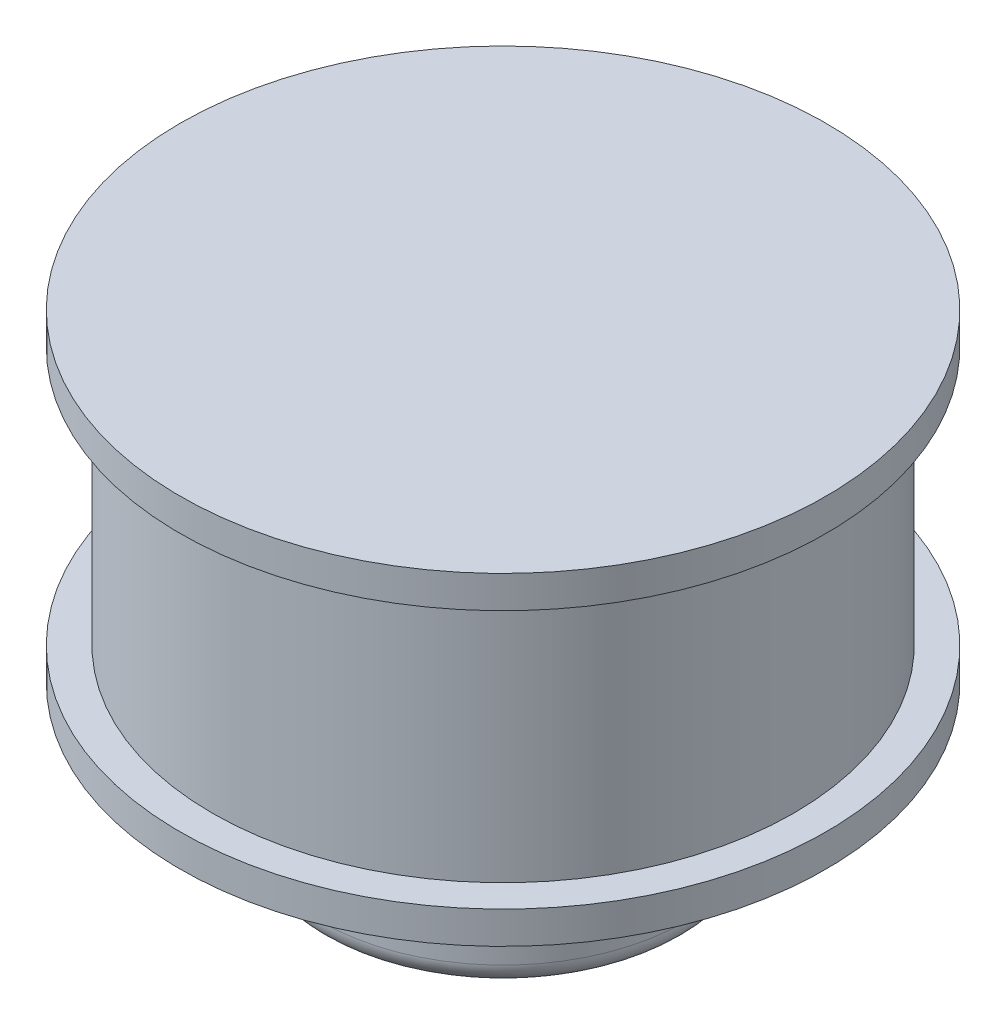
ISO-10303-21;
HEADER;
FILE_DESCRIPTION(('STEP AP214'),'2;1');
FILE_NAME('part.step','',(''),(''),'','','');
FILE_SCHEMA(('AUTOMOTIVE_DESIGN { 1 0 10303 214 1 1 1 1 }'));
ENDSEC;
DATA;
#1=APPLICATION_CONTEXT('core data for automotive mechanical design processes');
#2=APPLICATION_PROTOCOL_DEFINITION('international standard','automotive_design',2000,#1);
#3=PRODUCT_CONTEXT('',#1,'mechanical');
#4=PRODUCT('Part','Part','',(#3));
#5=PRODUCT_RELATED_PRODUCT_CATEGORY('part','',(#4));
#6=PRODUCT_DEFINITION_FORMATION('','',#4);
#7=PRODUCT_DEFINITION_CONTEXT('part definition',#1,'design');
#8=PRODUCT_DEFINITION('design','',#6,#7);
#9=PRODUCT_DEFINITION_SHAPE('','',#8);
#10=(LENGTH_UNIT() NAMED_UNIT(*) SI_UNIT(.MILLI.,.METRE.));
#11=(NAMED_UNIT(*) PLANE_ANGLE_UNIT() SI_UNIT($,.RADIAN.));
#12=(NAMED_UNIT(*) SI_UNIT($,.STERADIAN.) SOLID_ANGLE_UNIT());
#13=UNCERTAINTY_MEASURE_WITH_UNIT(LENGTH_MEASURE(1.E-05),#10,'distance_accuracy_value','');
#14=(GEOMETRIC_REPRESENTATION_CONTEXT(3) GLOBAL_UNCERTAINTY_ASSIGNED_CONTEXT((#13)) GLOBAL_UNIT_ASSIGNED_CONTEXT((#10,
#11,#12)) REPRESENTATION_CONTEXT('',''));
#15=CARTESIAN_POINT('',(0.,0.,0.));
#16=DIRECTION('',(0.,0.,1.));
#17=DIRECTION('',(1.,0.,0.));
#18=AXIS2_PLACEMENT_3D('',#15,#16,#17);
#19=CARTESIAN_POINT('',(0.,7.65,0.));
#20=DIRECTION('',(0.,-1.,0.));
#21=DIRECTION('',(1.,0.,0.));
#22=AXIS2_PLACEMENT_3D('',#19,#20,#21);
#23=PLANE('',#22);
#24=CARTESIAN_POINT('',(0.,7.65,0.));
#25=DIRECTION('',(0.,1.,0.));
#26=DIRECTION('',(-1.,0.,0.));
#27=AXIS2_PLACEMENT_3D('',#24,#25,#26);
#28=CIRCLE('',#27,4.);
#29=CARTESIAN_POINT('',(-4.00000000000001,7.65,0.));
#30=VERTEX_POINT('',#29);
#31=EDGE_CURVE('E57',#30,#30,#28,.T.);
#32=ORIENTED_EDGE('',*,*,#31,.F.);
#33=EDGE_LOOP('',(#32));
#34=FACE_BOUND('',#33,.T.);
#35=ADVANCED_FACE('F37',(#34),#23,.T.);
#36=CARTESIAN_POINT('',(0.,15.,0.));
#37=DIRECTION('',(0.,1.,0.));
#38=DIRECTION('',(-1.,0.,0.));
#39=AXIS2_PLACEMENT_3D('',#36,#37,#38);
#40=CYLINDRICAL_SURFACE('',#39,3.99999999999999);
#41=CARTESIAN_POINT('',(-1.25,-2.35,3.79967103839267));
#42=CARTESIAN_POINT('',(-1.24999953780047,-2.28165296389066,3.79967145961936));
#43=CARTESIAN_POINT('',(-1.24437538791494,-2.2133012312968,3.80153531505043));
#44=CARTESIAN_POINT('',(-1.22209175401327,-2.07860583912219,3.80875638998877));
#45=CARTESIAN_POINT('',(-1.20542928782515,-2.01226272726784,3.81411455353136));
#46=CARTESIAN_POINT('',(-1.16169788223559,-1.883555098068,3.8276593883596));
#47=CARTESIAN_POINT('',(-1.13464735736677,-1.82118376689432,3.83584105194317));
#48=CARTESIAN_POINT('',(-1.07096914173157,-1.70184730413599,3.85410406218688));
#49=CARTESIAN_POINT('',(-1.03433975905632,-1.64488313003988,3.8641857443584));
#50=CARTESIAN_POINT('',(-0.951196070622291,-1.53602113250651,3.8855012766862));
#51=CARTESIAN_POINT('',(-0.904409399720397,-1.48433639056401,3.8967612338478));
#52=CARTESIAN_POINT('',(-0.802862046455493,-1.38940398679081,3.91894245860335));
#53=CARTESIAN_POINT('',(-0.748100252518563,-1.34615750305515,3.92986367872627));
#54=CARTESIAN_POINT('',(-0.630625912493361,-1.26838893698876,3.95043553390078));
#55=CARTESIAN_POINT('',(-0.567761556520093,-1.23408629616854,3.9600518456278));
#56=CARTESIAN_POINT('',(-0.436804232853402,-1.17662395014445,3.97662551833018));
#57=CARTESIAN_POINT('',(-0.368712498487051,-1.15346162585042,3.98358350419919));
#58=CARTESIAN_POINT('',(-0.231464356966097,-1.11964887190293,3.99387175820862));
#59=CARTESIAN_POINT('',(-0.162405715468215,-1.10863425021215,3.99730738984143));
#60=CARTESIAN_POINT('',(-0.0233408139845202,-1.09827565356248,4.00053595876014));
#61=CARTESIAN_POINT('',(0.0466652269730834,-1.09892902564117,4.00032972410064));
#62=CARTESIAN_POINT('',(0.183074480354734,-1.11164829158595,3.99637116132536));
#63=CARTESIAN_POINT('',(0.249518634314043,-1.12331938351302,3.99274150972157));
#64=CARTESIAN_POINT('',(0.379453063347769,-1.157094990043,3.98249482560854));
#65=CARTESIAN_POINT('',(0.442943145481195,-1.17920018508655,3.97587759827133));
#66=CARTESIAN_POINT('',(0.56607810315478,-1.23347018907489,3.96023459729532));
#67=CARTESIAN_POINT('',(0.62566640562283,-1.26575480856303,3.95118033616956));
#68=CARTESIAN_POINT('',(0.738702511152028,-1.33937109970456,3.93161722953561));
#69=CARTESIAN_POINT('',(0.792148756208836,-1.38070505913784,3.92110801644584));
#70=CARTESIAN_POINT('',(0.893737698453879,-1.47327363480129,3.89923670734646));
#71=CARTESIAN_POINT('',(0.941566549094177,-1.5248490688412,3.88785731989083));
#72=CARTESIAN_POINT('',(1.02798974259538,-1.63539510182446,3.86590615440412));
#73=CARTESIAN_POINT('',(1.06658299775341,-1.694366570575,3.85533447159846));
#74=CARTESIAN_POINT('',(1.13380465019765,-1.81891746885984,3.83610846648973));
#75=CARTESIAN_POINT('',(1.16231680702682,-1.88456340904239,3.82747690354323));
#76=CARTESIAN_POINT('',(1.20778345948513,-2.02005949189535,3.81337545338912));
#77=CARTESIAN_POINT('',(1.22474210765793,-2.08990811421048,3.80790443033293));
#78=CARTESIAN_POINT('',(1.24601485185708,-2.22881995256584,3.80099563391871));
#79=CARTESIAN_POINT('',(1.25080954353711,-2.29780199623211,3.79940466389695));
#80=CARTESIAN_POINT('',(1.24896744498307,-2.43558974149816,3.80001077463983));
#81=CARTESIAN_POINT('',(1.24233242111456,-2.50439546870047,3.80220727008389));
#82=CARTESIAN_POINT('',(1.21824873513143,-2.63780829665165,3.80998957482873));
#83=CARTESIAN_POINT('',(1.20111831160537,-2.70247927407399,3.81547554101731));
#84=CARTESIAN_POINT('',(1.15690373661027,-2.82802179199604,3.8291128733166));
#85=CARTESIAN_POINT('',(1.12981796171154,-2.88889271092119,3.83726467412387));
#86=CARTESIAN_POINT('',(1.06557510655875,-3.00703910977175,3.85560539653155));
#87=CARTESIAN_POINT('',(1.02815147488557,-3.06416141559277,3.86584603489732));
#88=CARTESIAN_POINT('',(0.94460640867981,-3.17149034636192,3.88710348972828));
#89=CARTESIAN_POINT('',(0.898482714690783,-3.22169516892534,3.89812050735702));
#90=CARTESIAN_POINT('',(0.796572947753604,-3.31591036591281,3.92024187562679));
#91=CARTESIAN_POINT('',(0.740465649788521,-3.35957778613986,3.93133092285679));
#92=CARTESIAN_POINT('',(0.621451545651398,-3.43689104332125,3.95189059843678));
#93=CARTESIAN_POINT('',(0.558545051108623,-3.47053733931104,3.96136130090945));
#94=CARTESIAN_POINT('',(0.428105523331832,-3.52653056247168,3.97756311928511));
#95=CARTESIAN_POINT('',(0.360610184283756,-3.54895928784368,3.98431399561199));
#96=CARTESIAN_POINT('',(0.22255725405639,-3.5820725385897,3.99440242648576));
#97=CARTESIAN_POINT('',(0.152000628340357,-3.59276073908349,3.99774104914277));
#98=CARTESIAN_POINT('',(0.0129849366488996,-3.60179100174962,4.00055803404461));
#99=CARTESIAN_POINT('',(-0.0554391919465212,-3.60062845017076,4.00019129407389));
#100=CARTESIAN_POINT('',(-0.191073221923247,-3.5871881889513,3.99600978081048));
#101=CARTESIAN_POINT('',(-0.258283202179567,-3.57491120400805,3.99219523232618));
#102=CARTESIAN_POINT('',(-0.38875511848079,-3.53990599077772,3.98159570844795));
#103=CARTESIAN_POINT('',(-0.45205591844948,-3.51731039215463,3.97484847960205));
#104=CARTESIAN_POINT('',(-0.57399842550009,-3.46242917279152,3.9590794558795));
#105=CARTESIAN_POINT('',(-0.632639331274481,-3.43014189002657,3.95005727091358));
#106=CARTESIAN_POINT('',(-0.745761694969687,-3.35552724165556,3.93029896883376));
#107=CARTESIAN_POINT('',(-0.80003460705311,-3.31289647753603,3.91951509750962));
#108=CARTESIAN_POINT('',(-0.900820791399317,-3.21934011055653,3.89758736547061));
#109=CARTESIAN_POINT('',(-0.947331733504159,-3.16841202586061,3.88644339784826));
#110=CARTESIAN_POINT('',(-1.03282865911252,-3.0576842801589,3.86461892577438));
#111=CARTESIAN_POINT('',(-1.07151427994711,-2.99764659688342,3.85396600863456));
#112=CARTESIAN_POINT('',(-1.13820470748521,-2.87160187973086,3.83480125279531));
#113=CARTESIAN_POINT('',(-1.16621383403546,-2.80559727354975,3.82628854861386));
#114=CARTESIAN_POINT('',(-1.20871180435792,-2.67527738268533,3.81306560440327));
#115=CARTESIAN_POINT('',(-1.22414939837873,-2.61129745254843,3.80809315043749));
#116=CARTESIAN_POINT('',(-1.24479245816099,-2.48154616790351,3.80139606482399));
#117=CARTESIAN_POINT('',(-1.25000044480778,-2.4157752587985,3.79967063301598));
#118=CARTESIAN_POINT('',(-1.25,-2.35,3.79967103839267));
#119=B_SPLINE_CURVE_WITH_KNOTS('',3,(#41,#42,#43,#44,#45,#46,#47,#48,#49,#50,#51,#52,#53,#54,
#55,#56,#57,#58,#59,#60,#61,#62,#63,#64,#65,#66,#67,#68,#69,#70,#71,#72,#73,#74,#75,#76,#77,#78,
#79,#80,#81,#82,#83,#84,#85,#86,#87,#88,#89,#90,#91,#92,#93,#94,#95,#96,#97,#98,#99,#100,#101,
#102,#103,#104,#105,#106,#107,#108,#109,#110,#111,#112,#113,#114,#115,#116,#117,#118),
.UNSPECIFIED.,.T.,.F.,(4,2,2,2,2,2,2,2,2,2,2,2,2,2,2,2,2,2,2,2,2,2,2,2,2,2,2,2,2,2,2,2,2,2,2,2,
2,2,4),(0.,0.20479813754849,0.409651627059735,0.614143644118582,0.818671804924948,
1.02957080550838,1.24049922941123,1.45619821963733,1.67184647417922,1.88083722835533,
2.08978046471774,2.2915098296975,2.49325235190093,2.69746404608409,2.90172742713187,
3.11450338937334,3.32730439853776,3.54248470934454,3.75758763952752,3.96404933287935,
4.17047912219089,4.37093972044363,4.57143302253209,4.7776761330961,4.9839728801188,
5.19881937811511,5.41365603317086,5.62690239290998,5.84008198140584,6.04438802439524,
6.24868074692306,6.45041846514759,6.65219079911652,6.86080693105215,7.0694855777219,
7.28507795501704,7.50058300803822,7.69772354371386,7.89481549188779),.UNSPECIFIED.);
#120=CARTESIAN_POINT('',(-1.25,-2.35,3.79967103839267));
#121=VERTEX_POINT('',#120);
#122=EDGE_CURVE('E81',#121,#121,#119,.T.);
#123=ORIENTED_EDGE('',*,*,#122,.F.);
#124=EDGE_LOOP('',(#123));
#125=FACE_BOUND('',#124,.T.);
#126=CARTESIAN_POINT('',(0.,-5.35000000000001,0.));
#127=DIRECTION('',(0.,-1.,0.));
#128=DIRECTION('',(1.,0.,0.));
#129=AXIS2_PLACEMENT_3D('',#126,#127,#128);
#130=CIRCLE('',#129,3.99999999999999);
#131=CARTESIAN_POINT('',(3.99999999999998,-5.35000000000001,0.));
#132=VERTEX_POINT('',#131);
#133=EDGE_CURVE('E10',#132,#132,#130,.T.);
#134=ORIENTED_EDGE('',*,*,#133,.T.);
#135=EDGE_LOOP('',(#134));
#136=FACE_BOUND('',#135,.T.);
#137=ORIENTED_EDGE('',*,*,#31,.T.);
#138=EDGE_LOOP('',(#137));
#139=FACE_BOUND('',#138,.T.);
#140=ADVANCED_FACE('F94',(#125,#136,#139),#40,.F.);
#141=CARTESIAN_POINT('',(-4.00000000000001,-6.35,0.));
#142=DIRECTION('',(0.,-1.,0.));
#143=DIRECTION('',(1.,0.,0.));
#144=AXIS2_PLACEMENT_3D('',#141,#142,#143);
#145=PLANE('',#144);
#146=CARTESIAN_POINT('',(0.,-6.35,0.));
#147=DIRECTION('',(0.,-1.,0.));
#148=DIRECTION('',(1.,0.,0.));
#149=AXIS2_PLACEMENT_3D('',#146,#147,#148);
#150=CIRCLE('',#149,7.49999999999998);
#151=CARTESIAN_POINT('',(7.49999999999997,-6.35000000000001,0.));
#152=VERTEX_POINT('',#151);
#153=EDGE_CURVE('E44',#152,#152,#150,.T.);
#154=ORIENTED_EDGE('',*,*,#153,.T.);
#155=EDGE_LOOP('',(#154));
#156=FACE_BOUND('',#155,.T.);
#157=CARTESIAN_POINT('',(0.,-6.35,0.));
#158=DIRECTION('',(0.,-1.,0.));
#159=DIRECTION('',(1.,0.,0.));
#160=AXIS2_PLACEMENT_3D('',#157,#158,#159);
#161=CIRCLE('',#160,4.99999999999999);
#162=CARTESIAN_POINT('',(4.99999999999998,-6.35000000000001,0.));
#163=VERTEX_POINT('',#162);
#164=EDGE_CURVE('E48',#163,#163,#161,.F.);
#165=ORIENTED_EDGE('',*,*,#164,.T.);
#166=EDGE_LOOP('',(#165));
#167=FACE_BOUND('',#166,.T.);
#168=ADVANCED_FACE('F136',(#156,#167),#145,.T.);
#169=CARTESIAN_POINT('',(0.,15.,0.));
#170=DIRECTION('',(0.,1.,0.));
#171=DIRECTION('',(-1.,0.,0.));
#172=AXIS2_PLACEMENT_3D('',#169,#170,#171);
#173=CYLINDRICAL_SURFACE('',#172,8.49999999999998);
#174=CARTESIAN_POINT('',(-1.25,-2.35,8.4075858604001));
#175=CARTESIAN_POINT('',(-1.24999710510227,-2.41980453073489,8.40758700940733));
#176=CARTESIAN_POINT('',(-1.24413302561147,-2.48964997741464,8.40846460016199));
#177=CARTESIAN_POINT('',(-1.22083722377046,-2.62738920999669,8.41187789658695));
#178=CARTESIAN_POINT('',(-1.20339411636136,-2.69528100635837,8.41441523416454));
#179=CARTESIAN_POINT('',(-1.15747242113108,-2.82709919596176,8.42085456460098));
#180=CARTESIAN_POINT('',(-1.12900217790827,-2.89102854538422,8.42475552534397));
#181=CARTESIAN_POINT('',(-1.06185381528302,-3.01319320199757,8.4334813344008));
#182=CARTESIAN_POINT('',(-1.02317714404783,-3.07142931538375,8.43830605161826));
#183=CARTESIAN_POINT('',(-0.936395680627589,-3.18101217151486,8.44837729235548));
#184=CARTESIAN_POINT('',(-0.888227811627049,-3.23230872243697,8.45362649120865));
#185=CARTESIAN_POINT('',(-0.783967427241611,-3.32612155151427,8.46393134335554));
#186=CARTESIAN_POINT('',(-0.727874481842023,-3.36863735291758,8.46898698612797));
#187=CARTESIAN_POINT('',(-0.609035362725141,-3.443866414533,8.47836301592179));
#188=CARTESIAN_POINT('',(-0.546259688480515,-3.47653354619391,8.48267990326486));
#189=CARTESIAN_POINT('',(-0.416038601354241,-3.53084201956213,8.49006242091286));
#190=CARTESIAN_POINT('',(-0.348593426034826,-3.55248392171367,8.49312811481798));
#191=CARTESIAN_POINT('',(-0.211464398495229,-3.58397570100462,8.4976439545144));
#192=CARTESIAN_POINT('',(-0.141800218809726,-3.59390956510211,8.49910560156348));
#193=CARTESIAN_POINT('',(-0.00177945680602902,-3.60196400477364,8.50028806047438));
#194=CARTESIAN_POINT('',(0.0685770882440763,-3.60008521275468,8.50000896552925));
#195=CARTESIAN_POINT('',(0.207412609267973,-3.58463408157611,8.4977505909803));
#196=CARTESIAN_POINT('',(0.275901884682541,-3.57115209517445,8.49578444857935));
#197=CARTESIAN_POINT('',(0.409635277137456,-3.53301903013746,8.49038753926087));
#198=CARTESIAN_POINT('',(0.474879313262818,-3.50836767316603,8.48695673584471));
#199=CARTESIAN_POINT('',(0.600544454522746,-3.44850267880972,8.47899339387313));
#200=CARTESIAN_POINT('',(0.660947113655844,-3.41325087024622,8.47445688515937));
#201=CARTESIAN_POINT('',(0.775013746624385,-3.33321349734632,8.4647879743403));
#202=CARTESIAN_POINT('',(0.828677293524277,-3.2884273294741,8.45965553452123));
#203=CARTESIAN_POINT('',(0.928274771197665,-3.19008886925554,8.44931012765941));
#204=CARTESIAN_POINT('',(0.974130833440613,-3.13645770813847,8.44409685803328));
#205=CARTESIAN_POINT('',(1.05620396332034,-3.02221998520642,8.4342247592641));
#206=CARTESIAN_POINT('',(1.09242097588368,-2.96161338353955,8.42956593328899));
#207=CARTESIAN_POINT('',(1.15419768439827,-2.83506551078188,8.42133032189467));
#208=CARTESIAN_POINT('',(1.17974960098851,-2.76912038736885,8.41775432683683));
#209=CARTESIAN_POINT('',(1.21939363445995,-2.63381043135111,8.41210341899181));
#210=CARTESIAN_POINT('',(1.23348652609985,-2.56444583027786,8.41002840472254));
#211=CARTESIAN_POINT('',(1.24970613657199,-2.424958088404,8.40763356673706));
#212=CARTESIAN_POINT('',(1.25194313773078,-2.35484803916849,8.407297567564));
#213=CARTESIAN_POINT('',(1.2446798881272,-2.2152540518017,8.40837587949709));
#214=CARTESIAN_POINT('',(1.23517998693919,-2.14577009508484,8.40979013847319));
#215=CARTESIAN_POINT('',(1.20480604960235,-2.00974092572747,8.4141947693031));
#216=CARTESIAN_POINT('',(1.18398676081403,-1.94318322137568,8.41717755257086));
#217=CARTESIAN_POINT('',(1.13162190536935,-1.81450233792372,8.42437690391729));
#218=CARTESIAN_POINT('',(1.10007582796816,-1.75237937014933,8.42859353074281));
#219=CARTESIAN_POINT('',(1.02688712390612,-1.63383645623596,8.43782365247835));
#220=CARTESIAN_POINT('',(0.985172989894861,-1.57746109871345,8.4428427004129));
#221=CARTESIAN_POINT('',(0.892931901207412,-1.47247162445458,8.45309533274158));
#222=CARTESIAN_POINT('',(0.842404468153761,-1.42385792928834,8.45832892876937));
#223=CARTESIAN_POINT('',(0.733485882129774,-1.33537678145347,8.4684714097738));
#224=CARTESIAN_POINT('',(0.675035107129496,-1.29558233714803,8.4733773652361));
#225=CARTESIAN_POINT('',(0.552214316327239,-1.22637752257722,8.48226649910812));
#226=CARTESIAN_POINT('',(0.487844457355883,-1.19696687728508,8.48624970195703));
#227=CARTESIAN_POINT('',(0.35524251224269,-1.14948167280522,8.49283167617489));
#228=CARTESIAN_POINT('',(0.287025077389439,-1.1313669085891,8.49543535260938));
#229=CARTESIAN_POINT('',(0.148475541166708,-1.10685746976604,8.49898547341226));
#230=CARTESIAN_POINT('',(0.078143574092852,-1.10046205244554,8.4999320228009));
#231=CARTESIAN_POINT('',(-0.0619298668379427,-1.09959043847321,8.50006025774636));
#232=CARTESIAN_POINT('',(-0.131670655626724,-1.10500242581344,8.49925849979375));
#233=CARTESIAN_POINT('',(-0.269239179820509,-1.12735268404478,8.49601352815674));
#234=CARTESIAN_POINT('',(-0.337066920661138,-1.14429092218239,8.49357031913675));
#235=CARTESIAN_POINT('',(-0.468855272056407,-1.18917375779886,8.48731568295443));
#236=CARTESIAN_POINT('',(-0.53281846476078,-1.21711091026107,8.48350518144818));
#237=CARTESIAN_POINT('',(-0.65516692911588,-1.28318667714564,8.47493492093454));
#238=CARTESIAN_POINT('',(-0.713552033805032,-1.32132559679434,8.47017513352659));
#239=CARTESIAN_POINT('',(-0.823654696466402,-1.40712783748201,8.46018209258475));
#240=CARTESIAN_POINT('',(-0.875307495715044,-1.45487381362391,8.45494496231287));
#241=CARTESIAN_POINT('',(-0.969908817337546,-1.55836101063896,8.44461647463573));
#242=CARTESIAN_POINT('',(-1.01285529235082,-1.61410410684719,8.43952515175938));
#243=CARTESIAN_POINT('',(-1.08903160606815,-1.73235548954973,8.43003535108944));
#244=CARTESIAN_POINT('',(-1.12220785319988,-1.79489860353564,8.42564075353029));
#245=CARTESIAN_POINT('',(-1.17753570240274,-1.92470372470936,8.41808744433525));
#246=CARTESIAN_POINT('',(-1.19969881567852,-1.99196072054425,8.41492744301017));
#247=CARTESIAN_POINT('',(-1.22730605825343,-2.10793825107537,8.41093594969733));
#248=CARTESIAN_POINT('',(-1.23580336635801,-2.15594037642951,8.40968627498972));
#249=CARTESIAN_POINT('',(-1.24715131261068,-2.25262170189715,8.40801083456297));
#250=CARTESIAN_POINT('',(-1.25000201962438,-2.3013008937459,8.40758505879561));
#251=CARTESIAN_POINT('',(-1.25,-2.35,8.4075858604001));
#252=B_SPLINE_CURVE_WITH_KNOTS('',3,(#174,#175,#176,#177,#178,#179,#180,#181,#182,#183,#184,
#185,#186,#187,#188,#189,#190,#191,#192,#193,#194,#195,#196,#197,#198,#199,#200,#201,#202,#203,
#204,#205,#206,#207,#208,#209,#210,#211,#212,#213,#214,#215,#216,#217,#218,#219,#220,#221,#222,
#223,#224,#225,#226,#227,#228,#229,#230,#231,#232,#233,#234,#235,#236,#237,#238,#239,#240,#241,
#242,#243,#244,#245,#246,#247,#248,#249,#250,#251),.UNSPECIFIED.,.T.,.F.,(4,2,2,2,2,2,2,2,2,2,2,
2,2,2,2,2,2,2,2,2,2,2,2,2,2,2,2,2,2,2,2,2,2,2,2,2,2,2,4),(0.,0.209235604041356,
0.418677243956453,0.627960701137761,0.837214479508835,1.04790891372791,1.25861478462188,
1.47029273888423,1.68195993187107,1.8920993174321,2.10222745298405,2.3107339980099,
2.51924573921819,2.72851748935693,2.93780249057731,3.14906598586866,3.36033068820407,
3.57174922359479,3.78315346353082,3.99258774581622,4.20201579041742,4.41043981091346,
4.61887375669135,4.82881810275996,5.03877384795543,5.2504076330159,5.46203581229343,
5.67290638591943,5.8837635951614,6.09263266274006,6.30150113679018,6.51022847299387,
6.71896205480251,6.92957482323234,7.14023706160589,7.35203417379323,7.56360944219752,
7.70958436789297,7.85555751327589),.UNSPECIFIED.);
#253=CARTESIAN_POINT('',(-1.25,-2.35,8.4075858604001));
#254=VERTEX_POINT('',#253);
#255=EDGE_CURVE('E89',#254,#254,#252,.T.);
#256=ORIENTED_EDGE('',*,*,#255,.F.);
#257=EDGE_LOOP('',(#256));
#258=FACE_BOUND('',#257,.T.);
#259=CARTESIAN_POINT('',(0.,-5.35000000000001,0.));
#260=DIRECTION('',(0.,-1.,0.));
#261=DIRECTION('',(1.,0.,0.));
#262=AXIS2_PLACEMENT_3D('',#259,#260,#261);
#263=CIRCLE('',#262,8.49999999999998);
#264=CARTESIAN_POINT('',(8.49999999999997,-5.35000000000001,0.));
#265=VERTEX_POINT('',#264);
#266=EDGE_CURVE('E52',#265,#265,#263,.F.);
#267=ORIENTED_EDGE('',*,*,#266,.T.);
#268=EDGE_LOOP('',(#267));
#269=FACE_BOUND('',#268,.T.);
#270=CARTESIAN_POINT('',(0.,0.,0.));
#271=DIRECTION('',(0.,1.,0.));
#272=DIRECTION('',(-1.,0.,0.));
#273=AXIS2_PLACEMENT_3D('',#270,#271,#272);
#274=CIRCLE('',#273,8.49999999999998);
#275=CARTESIAN_POINT('',(-8.49999999999999,0.,0.));
#276=VERTEX_POINT('',#275);
#277=EDGE_CURVE('E60',#276,#276,#274,.T.);
#278=ORIENTED_EDGE('',*,*,#277,.F.);
#279=EDGE_LOOP('',(#278));
#280=FACE_BOUND('',#279,.T.);
#281=ADVANCED_FACE('F133',(#258,#269,#280),#173,.T.);
#282=CARTESIAN_POINT('',(-8.49999999999999,0.,0.));
#283=DIRECTION('',(0.,-1.,0.));
#284=DIRECTION('',(1.,0.,0.));
#285=AXIS2_PLACEMENT_3D('',#282,#283,#284);
#286=PLANE('',#285);
#287=ORIENTED_EDGE('',*,*,#277,.T.);
#288=EDGE_LOOP('',(#287));
#289=FACE_BOUND('',#288,.T.);
#290=CARTESIAN_POINT('',(0.,0.,0.));
#291=DIRECTION('',(0.,1.,0.));
#292=DIRECTION('',(-1.,0.,0.));
#293=AXIS2_PLACEMENT_3D('',#290,#291,#292);
#294=CIRCLE('',#293,15.);
#295=CARTESIAN_POINT('',(-15.,0.,0.));
#296=VERTEX_POINT('',#295);
#297=EDGE_CURVE('E63',#296,#296,#294,.T.);
#298=ORIENTED_EDGE('',*,*,#297,.F.);
#299=EDGE_LOOP('',(#298));
#300=FACE_BOUND('',#299,.T.);
#301=ADVANCED_FACE('F129',(#289,#300),#286,.T.);
#302=CARTESIAN_POINT('',(0.,15.,0.));
#303=DIRECTION('',(0.,1.,0.));
#304=DIRECTION('',(-1.,0.,0.));
#305=AXIS2_PLACEMENT_3D('',#302,#303,#304);
#306=CYLINDRICAL_SURFACE('',#305,15.);
#307=ORIENTED_EDGE('',*,*,#297,.T.);
#308=EDGE_LOOP('',(#307));
#309=FACE_BOUND('',#308,.T.);
#310=CARTESIAN_POINT('',(0.,1.49999999999999,0.));
#311=DIRECTION('',(0.,1.,0.));
#312=DIRECTION('',(-1.,0.,0.));
#313=AXIS2_PLACEMENT_3D('',#310,#311,#312);
#314=CIRCLE('',#313,15.);
#315=CARTESIAN_POINT('',(-15.,1.5,0.));
#316=VERTEX_POINT('',#315);
#317=EDGE_CURVE('E66',#316,#316,#314,.T.);
#318=ORIENTED_EDGE('',*,*,#317,.F.);
#319=EDGE_LOOP('',(#318));
#320=FACE_BOUND('',#319,.T.);
#321=ADVANCED_FACE('F125',(#309,#320),#306,.T.);
#322=CARTESIAN_POINT('',(-15.,1.5,0.));
#323=DIRECTION('',(0.,1.,0.));
#324=DIRECTION('',(-1.,0.,0.));
#325=AXIS2_PLACEMENT_3D('',#322,#323,#324);
#326=PLANE('',#325);
#327=ORIENTED_EDGE('',*,*,#317,.T.);
#328=EDGE_LOOP('',(#327));
#329=FACE_BOUND('',#328,.T.);
#330=CARTESIAN_POINT('',(0.,1.49999999999999,0.));
#331=DIRECTION('',(0.,1.,0.));
#332=DIRECTION('',(-1.,0.,0.));
#333=AXIS2_PLACEMENT_3D('',#330,#331,#332);
#334=CIRCLE('',#333,13.5);
#335=CARTESIAN_POINT('',(-13.5,1.5,0.));
#336=VERTEX_POINT('',#335);
#337=EDGE_CURVE('E69',#336,#336,#334,.T.);
#338=ORIENTED_EDGE('',*,*,#337,.F.);
#339=EDGE_LOOP('',(#338));
#340=FACE_BOUND('',#339,.T.);
#341=ADVANCED_FACE('F121',(#329,#340),#326,.T.);
#342=CARTESIAN_POINT('',(0.,15.,0.));
#343=DIRECTION('',(0.,1.,0.));
#344=DIRECTION('',(-1.,0.,0.));
#345=AXIS2_PLACEMENT_3D('',#342,#343,#344);
#346=CYLINDRICAL_SURFACE('',#345,13.5);
#347=ORIENTED_EDGE('',*,*,#337,.T.);
#348=EDGE_LOOP('',(#347));
#349=FACE_BOUND('',#348,.T.);
#350=CARTESIAN_POINT('',(0.,13.5,0.));
#351=DIRECTION('',(0.,1.,0.));
#352=DIRECTION('',(-1.,0.,0.));
#353=AXIS2_PLACEMENT_3D('',#350,#351,#352);
#354=CIRCLE('',#353,13.5);
#355=CARTESIAN_POINT('',(-13.5,13.5,0.));
#356=VERTEX_POINT('',#355);
#357=EDGE_CURVE('E72',#356,#356,#354,.T.);
#358=ORIENTED_EDGE('',*,*,#357,.F.);
#359=EDGE_LOOP('',(#358));
#360=FACE_BOUND('',#359,.T.);
#361=ADVANCED_FACE('F117',(#349,#360),#346,.T.);
#362=CARTESIAN_POINT('',(-13.5,13.5,0.));
#363=DIRECTION('',(0.,-1.,0.));
#364=DIRECTION('',(1.,0.,0.));
#365=AXIS2_PLACEMENT_3D('',#362,#363,#364);
#366=PLANE('',#365);
#367=ORIENTED_EDGE('',*,*,#357,.T.);
#368=EDGE_LOOP('',(#367));
#369=FACE_BOUND('',#368,.T.);
#370=CARTESIAN_POINT('',(0.,13.5,0.));
#371=DIRECTION('',(0.,1.,0.));
#372=DIRECTION('',(-1.,0.,0.));
#373=AXIS2_PLACEMENT_3D('',#370,#371,#372);
#374=CIRCLE('',#373,15.);
#375=CARTESIAN_POINT('',(-15.,13.5,0.));
#376=VERTEX_POINT('',#375);
#377=EDGE_CURVE('E75',#376,#376,#374,.T.);
#378=ORIENTED_EDGE('',*,*,#377,.F.);
#379=EDGE_LOOP('',(#378));
#380=FACE_BOUND('',#379,.T.);
#381=ADVANCED_FACE('F113',(#369,#380),#366,.T.);
#382=CARTESIAN_POINT('',(0.,15.,0.));
#383=DIRECTION('',(0.,1.,0.));
#384=DIRECTION('',(-1.,0.,0.));
#385=AXIS2_PLACEMENT_3D('',#382,#383,#384);
#386=CYLINDRICAL_SURFACE('',#385,15.);
#387=ORIENTED_EDGE('',*,*,#377,.T.);
#388=EDGE_LOOP('',(#387));
#389=FACE_BOUND('',#388,.T.);
#390=CARTESIAN_POINT('',(0.,15.,0.));
#391=DIRECTION('',(0.,1.,0.));
#392=DIRECTION('',(-1.,0.,0.));
#393=AXIS2_PLACEMENT_3D('',#390,#391,#392);
#394=CIRCLE('',#393,15.);
#395=CARTESIAN_POINT('',(-15.,15.,0.));
#396=VERTEX_POINT('',#395);
#397=EDGE_CURVE('E78',#396,#396,#394,.T.);
#398=ORIENTED_EDGE('',*,*,#397,.F.);
#399=EDGE_LOOP('',(#398));
#400=FACE_BOUND('',#399,.T.);
#401=ADVANCED_FACE('F109',(#389,#400),#386,.T.);
#402=CARTESIAN_POINT('',(-15.,15.,0.));
#403=DIRECTION('',(0.,1.,0.));
#404=DIRECTION('',(-1.,0.,0.));
#405=AXIS2_PLACEMENT_3D('',#402,#403,#404);
#406=PLANE('',#405);
#407=ORIENTED_EDGE('',*,*,#397,.T.);
#408=EDGE_LOOP('',(#407));
#409=FACE_BOUND('',#408,.T.);
#410=ADVANCED_FACE('F105',(#409),#406,.T.);
#411=CARTESIAN_POINT('',(0.,-5.35000000000001,0.));
#412=DIRECTION('',(0.,-1.,0.));
#413=DIRECTION('',(1.,0.,0.));
#414=AXIS2_PLACEMENT_3D('',#411,#412,#413);
#415=TOROIDAL_SURFACE('',#414,7.49999999999998,1.);
#416=ORIENTED_EDGE('',*,*,#153,.F.);
#417=EDGE_LOOP('',(#416));
#418=FACE_BOUND('',#417,.T.);
#419=ORIENTED_EDGE('',*,*,#266,.F.);
#420=EDGE_LOOP('',(#419));
#421=FACE_BOUND('',#420,.T.);
#422=ADVANCED_FACE('F108',(#418,#421),#415,.T.);
#423=CARTESIAN_POINT('',(0.,-5.35000000000001,0.));
#424=DIRECTION('',(0.,-1.,0.));
#425=DIRECTION('',(1.,0.,0.));
#426=AXIS2_PLACEMENT_3D('',#423,#424,#425);
#427=TOROIDAL_SURFACE('',#426,4.99999999999999,1.);
#428=ORIENTED_EDGE('',*,*,#133,.F.);
#429=EDGE_LOOP('',(#428));
#430=FACE_BOUND('',#429,.T.);
#431=ORIENTED_EDGE('',*,*,#164,.F.);
#432=EDGE_LOOP('',(#431));
#433=FACE_BOUND('',#432,.T.);
#434=ADVANCED_FACE('F39',(#430,#433),#427,.T.);
#435=CARTESIAN_POINT('',(0.,-2.35,0.));
#436=DIRECTION('',(0.,0.,-1.));
#437=DIRECTION('',(-1.,0.,0.));
#438=AXIS2_PLACEMENT_3D('',#435,#436,#437);
#439=CYLINDRICAL_SURFACE('',#438,1.25);
#440=ORIENTED_EDGE('',*,*,#122,.T.);
#441=EDGE_LOOP('',(#440));
#442=FACE_BOUND('',#441,.T.);
#443=ORIENTED_EDGE('',*,*,#255,.T.);
#444=EDGE_LOOP('',(#443));
#445=FACE_BOUND('',#444,.T.);
#446=ADVANCED_FACE('F98',(#442,#445),#439,.F.);
#447=CLOSED_SHELL('',(#35,#140,#168,#281,#301,#321,#341,#361,#381,#401,#410,#422,#434,#446));
#448=MANIFOLD_SOLID_BREP('B2',#447);
#449=ADVANCED_BREP_SHAPE_REPRESENTATION('',(#18,#448),#14);
#450=SHAPE_DEFINITION_REPRESENTATION(#9,#449);
ENDSEC;
END-ISO-10303-21;
